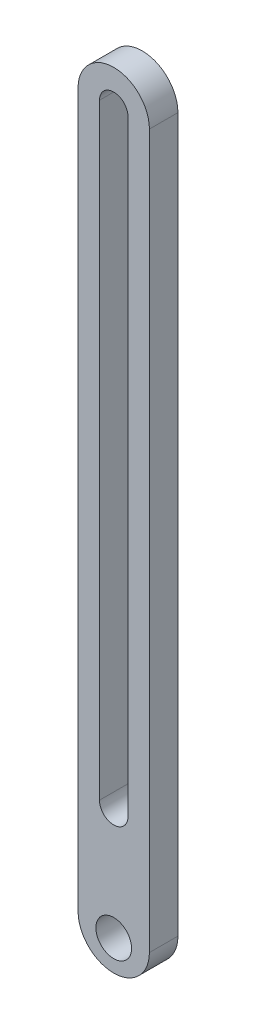
ISO-10303-21;
HEADER;
FILE_DESCRIPTION(('STEP AP214'),'2;1');
FILE_NAME('part.step','',(''),(''),'','','');
FILE_SCHEMA(('AUTOMOTIVE_DESIGN { 1 0 10303 214 1 1 1 1 }'));
ENDSEC;
DATA;
#1=APPLICATION_CONTEXT('core data for automotive mechanical design processes');
#2=APPLICATION_PROTOCOL_DEFINITION('international standard','automotive_design',2000,#1);
#3=PRODUCT_CONTEXT('',#1,'mechanical');
#4=PRODUCT('Part','Part','',(#3));
#5=PRODUCT_RELATED_PRODUCT_CATEGORY('part','',(#4));
#6=PRODUCT_DEFINITION_FORMATION('','',#4);
#7=PRODUCT_DEFINITION_CONTEXT('part definition',#1,'design');
#8=PRODUCT_DEFINITION('design','',#6,#7);
#9=PRODUCT_DEFINITION_SHAPE('','',#8);
#10=(LENGTH_UNIT() NAMED_UNIT(*) SI_UNIT(.MILLI.,.METRE.));
#11=(NAMED_UNIT(*) PLANE_ANGLE_UNIT() SI_UNIT($,.RADIAN.));
#12=(NAMED_UNIT(*) SI_UNIT($,.STERADIAN.) SOLID_ANGLE_UNIT());
#13=UNCERTAINTY_MEASURE_WITH_UNIT(LENGTH_MEASURE(1.E-05),#10,'distance_accuracy_value','');
#14=(GEOMETRIC_REPRESENTATION_CONTEXT(3) GLOBAL_UNCERTAINTY_ASSIGNED_CONTEXT((#13)) GLOBAL_UNIT_ASSIGNED_CONTEXT((#10,
#11,#12)) REPRESENTATION_CONTEXT('',''));
#15=CARTESIAN_POINT('',(0.,0.,0.));
#16=DIRECTION('',(0.,0.,1.));
#17=DIRECTION('',(1.,0.,0.));
#18=AXIS2_PLACEMENT_3D('',#15,#16,#17);
#19=CARTESIAN_POINT('',(0.,174.996075103426,8.));
#20=DIRECTION('',(0.,0.,1.));
#21=DIRECTION('',(1.,0.,0.));
#22=AXIS2_PLACEMENT_3D('',#19,#20,#21);
#23=PLANE('',#22);
#24=CARTESIAN_POINT('',(0.,-26.4824837828525,8.));
#25=DIRECTION('',(0.,0.,1.));
#26=DIRECTION('',(1.,0.,0.));
#27=AXIS2_PLACEMENT_3D('',#24,#25,#26);
#28=CIRCLE('',#27,5.);
#29=CARTESIAN_POINT('',(5.,-26.4824837828525,8.));
#30=VERTEX_POINT('',#29);
#31=EDGE_CURVE('E227',#30,#30,#28,.T.);
#32=ORIENTED_EDGE('',*,*,#31,.F.);
#33=EDGE_LOOP('',(#32));
#34=FACE_BOUND('',#33,.T.);
#35=CARTESIAN_POINT('',(0.,174.996075103426,8.));
#36=DIRECTION('',(0.,0.,1.));
#37=DIRECTION('',(1.,0.,0.));
#38=AXIS2_PLACEMENT_3D('',#35,#36,#37);
#39=CIRCLE('',#38,10.);
#40=CARTESIAN_POINT('',(10.,174.996075103426,8.));
#41=VERTEX_POINT('',#40);
#42=CARTESIAN_POINT('',(-10.,174.996075103426,8.));
#43=VERTEX_POINT('',#42);
#44=EDGE_CURVE('E139',#41,#43,#39,.T.);
#45=ORIENTED_EDGE('',*,*,#44,.T.);
#46=DIRECTION('',(0.,-1.,0.));
#47=VECTOR('',#46,1.);
#48=CARTESIAN_POINT('',(-10.,174.996075103426,8.));
#49=LINE('',#48,#47);
#50=CARTESIAN_POINT('',(-10.,-25.0039248965737,8.));
#51=VERTEX_POINT('',#50);
#52=EDGE_CURVE('E142',#43,#51,#49,.T.);
#53=ORIENTED_EDGE('',*,*,#52,.T.);
#54=CARTESIAN_POINT('',(0.,-25.0039248965737,8.));
#55=DIRECTION('',(0.,0.,1.));
#56=DIRECTION('',(1.,0.,0.));
#57=AXIS2_PLACEMENT_3D('',#54,#55,#56);
#58=CIRCLE('',#57,10.);
#59=CARTESIAN_POINT('',(10.,-25.0039248965737,8.));
#60=VERTEX_POINT('',#59);
#61=EDGE_CURVE('E145',#51,#60,#58,.T.);
#62=ORIENTED_EDGE('',*,*,#61,.T.);
#63=DIRECTION('',(0.,1.,0.));
#64=VECTOR('',#63,1.);
#65=CARTESIAN_POINT('',(10.,174.996075103426,8.));
#66=LINE('',#65,#64);
#67=EDGE_CURVE('E147',#60,#41,#66,.T.);
#68=ORIENTED_EDGE('',*,*,#67,.T.);
#69=EDGE_LOOP('',(#45,#53,#62,#68));
#70=FACE_BOUND('',#69,.T.);
#71=DIRECTION('',(0.,-1.,0.));
#72=VECTOR('',#71,1.);
#73=CARTESIAN_POINT('',(-4.,174.996075103426,8.));
#74=LINE('',#73,#72);
#75=CARTESIAN_POINT('',(-4.,174.996075103426,8.));
#76=VERTEX_POINT('',#75);
#77=CARTESIAN_POINT('',(-3.99999999999998,4.99607510342631,8.));
#78=VERTEX_POINT('',#77);
#79=EDGE_CURVE('E109',#76,#78,#74,.T.);
#80=ORIENTED_EDGE('',*,*,#79,.F.);
#81=CARTESIAN_POINT('',(0.,174.996075103426,8.));
#82=DIRECTION('',(0.,0.,1.));
#83=DIRECTION('',(1.,0.,0.));
#84=AXIS2_PLACEMENT_3D('',#81,#82,#83);
#85=CIRCLE('',#84,4.);
#86=CARTESIAN_POINT('',(4.,174.996075103426,8.));
#87=VERTEX_POINT('',#86);
#88=EDGE_CURVE('E101',#87,#76,#85,.T.);
#89=ORIENTED_EDGE('',*,*,#88,.F.);
#90=DIRECTION('',(0.,1.,0.));
#91=VECTOR('',#90,1.);
#92=CARTESIAN_POINT('',(4.,174.996075103426,8.));
#93=LINE('',#92,#91);
#94=CARTESIAN_POINT('',(4.00000000000002,4.99607510342631,8.));
#95=VERTEX_POINT('',#94);
#96=EDGE_CURVE('E123',#95,#87,#93,.T.);
#97=ORIENTED_EDGE('',*,*,#96,.F.);
#98=CARTESIAN_POINT('',(0.,4.99607510342631,8.));
#99=DIRECTION('',(0.,0.,1.));
#100=DIRECTION('',(1.,0.,0.));
#101=AXIS2_PLACEMENT_3D('',#98,#99,#100);
#102=CIRCLE('',#101,4.);
#103=EDGE_CURVE('E121',#78,#95,#102,.T.);
#104=ORIENTED_EDGE('',*,*,#103,.F.);
#105=EDGE_LOOP('',(#80,#89,#97,#104));
#106=FACE_BOUND('',#105,.T.);
#107=ADVANCED_FACE('F36',(#34,#70,#106),#23,.T.);
#108=CARTESIAN_POINT('',(0.,174.996075103426,0.));
#109=DIRECTION('',(0.,0.,1.));
#110=DIRECTION('',(1.,0.,0.));
#111=AXIS2_PLACEMENT_3D('',#108,#109,#110);
#112=PLANE('',#111);
#113=CARTESIAN_POINT('',(0.,-26.4824837828525,0.));
#114=DIRECTION('',(0.,0.,1.));
#115=DIRECTION('',(1.,0.,0.));
#116=AXIS2_PLACEMENT_3D('',#113,#114,#115);
#117=CIRCLE('',#116,5.);
#118=CARTESIAN_POINT('',(5.,-26.4824837828525,0.));
#119=VERTEX_POINT('',#118);
#120=EDGE_CURVE('E129',#119,#119,#117,.T.);
#121=ORIENTED_EDGE('',*,*,#120,.T.);
#122=EDGE_LOOP('',(#121));
#123=FACE_BOUND('',#122,.T.);
#124=CARTESIAN_POINT('',(0.,174.996075103426,0.));
#125=DIRECTION('',(0.,0.,1.));
#126=DIRECTION('',(1.,0.,0.));
#127=AXIS2_PLACEMENT_3D('',#124,#125,#126);
#128=CIRCLE('',#127,10.);
#129=CARTESIAN_POINT('',(10.,174.996075103426,0.));
#130=VERTEX_POINT('',#129);
#131=CARTESIAN_POINT('',(-10.,174.996075103426,0.));
#132=VERTEX_POINT('',#131);
#133=EDGE_CURVE('E117',#130,#132,#128,.T.);
#134=ORIENTED_EDGE('',*,*,#133,.F.);
#135=DIRECTION('',(0.,1.,0.));
#136=VECTOR('',#135,1.);
#137=CARTESIAN_POINT('',(10.,174.996075103426,0.));
#138=LINE('',#137,#136);
#139=CARTESIAN_POINT('',(10.,-25.0039248965737,0.));
#140=VERTEX_POINT('',#139);
#141=EDGE_CURVE('E143',#140,#130,#138,.T.);
#142=ORIENTED_EDGE('',*,*,#141,.F.);
#143=CARTESIAN_POINT('',(0.,-25.0039248965737,0.));
#144=DIRECTION('',(0.,0.,1.));
#145=DIRECTION('',(1.,0.,0.));
#146=AXIS2_PLACEMENT_3D('',#143,#144,#145);
#147=CIRCLE('',#146,10.);
#148=CARTESIAN_POINT('',(-10.,-25.0039248965737,0.));
#149=VERTEX_POINT('',#148);
#150=EDGE_CURVE('E154',#149,#140,#147,.T.);
#151=ORIENTED_EDGE('',*,*,#150,.F.);
#152=DIRECTION('',(0.,-1.,0.));
#153=VECTOR('',#152,1.);
#154=CARTESIAN_POINT('',(-10.,174.996075103426,0.));
#155=LINE('',#154,#153);
#156=EDGE_CURVE('E152',#132,#149,#155,.T.);
#157=ORIENTED_EDGE('',*,*,#156,.F.);
#158=EDGE_LOOP('',(#134,#142,#151,#157));
#159=FACE_BOUND('',#158,.T.);
#160=CARTESIAN_POINT('',(0.,174.996075103426,0.));
#161=DIRECTION('',(0.,0.,1.));
#162=DIRECTION('',(1.,0.,0.));
#163=AXIS2_PLACEMENT_3D('',#160,#161,#162);
#164=CIRCLE('',#163,4.);
#165=CARTESIAN_POINT('',(4.,174.996075103426,0.));
#166=VERTEX_POINT('',#165);
#167=CARTESIAN_POINT('',(-4.,174.996075103426,0.));
#168=VERTEX_POINT('',#167);
#169=EDGE_CURVE('E59',#166,#168,#164,.T.);
#170=ORIENTED_EDGE('',*,*,#169,.T.);
#171=DIRECTION('',(0.,-1.,0.));
#172=VECTOR('',#171,1.);
#173=CARTESIAN_POINT('',(-4.,174.996075103426,0.));
#174=LINE('',#173,#172);
#175=CARTESIAN_POINT('',(-3.99999999999998,4.99607510342631,0.));
#176=VERTEX_POINT('',#175);
#177=EDGE_CURVE('E116',#168,#176,#174,.T.);
#178=ORIENTED_EDGE('',*,*,#177,.T.);
#179=CARTESIAN_POINT('',(0.,4.99607510342631,0.));
#180=DIRECTION('',(0.,0.,1.));
#181=DIRECTION('',(1.,0.,0.));
#182=AXIS2_PLACEMENT_3D('',#179,#180,#181);
#183=CIRCLE('',#182,4.);
#184=CARTESIAN_POINT('',(4.00000000000002,4.99607510342631,0.));
#185=VERTEX_POINT('',#184);
#186=EDGE_CURVE('E131',#176,#185,#183,.T.);
#187=ORIENTED_EDGE('',*,*,#186,.T.);
#188=DIRECTION('',(0.,1.,0.));
#189=VECTOR('',#188,1.);
#190=CARTESIAN_POINT('',(4.,174.996075103426,0.));
#191=LINE('',#190,#189);
#192=EDGE_CURVE('E110',#185,#166,#191,.T.);
#193=ORIENTED_EDGE('',*,*,#192,.T.);
#194=EDGE_LOOP('',(#170,#178,#187,#193));
#195=FACE_BOUND('',#194,.T.);
#196=ADVANCED_FACE('F172',(#123,#159,#195),#112,.F.);
#197=CARTESIAN_POINT('',(0.,174.996075103426,8.));
#198=DIRECTION('',(0.,0.,-1.));
#199=DIRECTION('',(-1.,0.,0.));
#200=AXIS2_PLACEMENT_3D('',#197,#198,#199);
#201=CYLINDRICAL_SURFACE('',#200,10.);
#202=ORIENTED_EDGE('',*,*,#133,.T.);
#203=DIRECTION('',(0.,0.,-1.));
#204=VECTOR('',#203,1.);
#205=CARTESIAN_POINT('',(-10.,174.996075103426,8.));
#206=LINE('',#205,#204);
#207=EDGE_CURVE('E11',#43,#132,#206,.T.);
#208=ORIENTED_EDGE('',*,*,#207,.F.);
#209=ORIENTED_EDGE('',*,*,#44,.F.);
#210=DIRECTION('',(0.,0.,-1.));
#211=VECTOR('',#210,1.);
#212=CARTESIAN_POINT('',(10.,174.996075103426,8.));
#213=LINE('',#212,#211);
#214=EDGE_CURVE('E149',#41,#130,#213,.T.);
#215=ORIENTED_EDGE('',*,*,#214,.T.);
#216=EDGE_LOOP('',(#202,#208,#209,#215));
#217=FACE_BOUND('',#216,.T.);
#218=ADVANCED_FACE('F38',(#217),#201,.T.);
#219=CARTESIAN_POINT('',(-10.,174.996075103426,8.));
#220=DIRECTION('',(1.,0.,0.));
#221=DIRECTION('',(0.,1.,0.));
#222=AXIS2_PLACEMENT_3D('',#219,#220,#221);
#223=PLANE('',#222);
#224=ORIENTED_EDGE('',*,*,#156,.T.);
#225=DIRECTION('',(0.,0.,-1.));
#226=VECTOR('',#225,1.);
#227=CARTESIAN_POINT('',(-10.,-25.0039248965737,8.));
#228=LINE('',#227,#226);
#229=EDGE_CURVE('E44',#51,#149,#228,.T.);
#230=ORIENTED_EDGE('',*,*,#229,.F.);
#231=ORIENTED_EDGE('',*,*,#52,.F.);
#232=ORIENTED_EDGE('',*,*,#207,.T.);
#233=EDGE_LOOP('',(#224,#230,#231,#232));
#234=FACE_BOUND('',#233,.T.);
#235=ADVANCED_FACE('F182',(#234),#223,.F.);
#236=CARTESIAN_POINT('',(0.,-25.0039248965737,8.));
#237=DIRECTION('',(0.,0.,-1.));
#238=DIRECTION('',(-1.,0.,0.));
#239=AXIS2_PLACEMENT_3D('',#236,#237,#238);
#240=CYLINDRICAL_SURFACE('',#239,10.);
#241=ORIENTED_EDGE('',*,*,#150,.T.);
#242=DIRECTION('',(0.,0.,-1.));
#243=VECTOR('',#242,1.);
#244=CARTESIAN_POINT('',(10.,-25.0039248965737,8.));
#245=LINE('',#244,#243);
#246=EDGE_CURVE('E159',#60,#140,#245,.T.);
#247=ORIENTED_EDGE('',*,*,#246,.F.);
#248=ORIENTED_EDGE('',*,*,#61,.F.);
#249=ORIENTED_EDGE('',*,*,#229,.T.);
#250=EDGE_LOOP('',(#241,#247,#248,#249));
#251=FACE_BOUND('',#250,.T.);
#252=ADVANCED_FACE('F166',(#251),#240,.T.);
#253=CARTESIAN_POINT('',(10.,174.996075103426,8.));
#254=DIRECTION('',(-1.,0.,0.));
#255=DIRECTION('',(0.,-1.,0.));
#256=AXIS2_PLACEMENT_3D('',#253,#254,#255);
#257=PLANE('',#256);
#258=ORIENTED_EDGE('',*,*,#141,.T.);
#259=ORIENTED_EDGE('',*,*,#214,.F.);
#260=ORIENTED_EDGE('',*,*,#67,.F.);
#261=ORIENTED_EDGE('',*,*,#246,.T.);
#262=EDGE_LOOP('',(#258,#259,#260,#261));
#263=FACE_BOUND('',#262,.T.);
#264=ADVANCED_FACE('F176',(#263),#257,.F.);
#265=CARTESIAN_POINT('',(0.,174.996075103426,8.));
#266=DIRECTION('',(0.,0.,-1.));
#267=DIRECTION('',(-1.,0.,0.));
#268=AXIS2_PLACEMENT_3D('',#265,#266,#267);
#269=CYLINDRICAL_SURFACE('',#268,4.);
#270=ORIENTED_EDGE('',*,*,#169,.F.);
#271=DIRECTION('',(0.,0.,-1.));
#272=VECTOR('',#271,1.);
#273=CARTESIAN_POINT('',(4.,174.996075103426,8.));
#274=LINE('',#273,#272);
#275=EDGE_CURVE('E105',#87,#166,#274,.T.);
#276=ORIENTED_EDGE('',*,*,#275,.F.);
#277=ORIENTED_EDGE('',*,*,#88,.T.);
#278=DIRECTION('',(0.,0.,-1.));
#279=VECTOR('',#278,1.);
#280=CARTESIAN_POINT('',(-4.,174.996075103426,8.));
#281=LINE('',#280,#279);
#282=EDGE_CURVE('E104',#76,#168,#281,.T.);
#283=ORIENTED_EDGE('',*,*,#282,.T.);
#284=EDGE_LOOP('',(#270,#276,#277,#283));
#285=FACE_BOUND('',#284,.T.);
#286=ADVANCED_FACE('F103',(#285),#269,.F.);
#287=CARTESIAN_POINT('',(-4.,174.996075103426,8.));
#288=DIRECTION('',(1.,0.,0.));
#289=DIRECTION('',(0.,1.,0.));
#290=AXIS2_PLACEMENT_3D('',#287,#288,#289);
#291=PLANE('',#290);
#292=ORIENTED_EDGE('',*,*,#177,.F.);
#293=ORIENTED_EDGE('',*,*,#282,.F.);
#294=ORIENTED_EDGE('',*,*,#79,.T.);
#295=DIRECTION('',(0.,0.,-1.));
#296=VECTOR('',#295,1.);
#297=CARTESIAN_POINT('',(-3.99999999999998,4.99607510342631,8.));
#298=LINE('',#297,#296);
#299=EDGE_CURVE('E118',#78,#176,#298,.T.);
#300=ORIENTED_EDGE('',*,*,#299,.T.);
#301=EDGE_LOOP('',(#292,#293,#294,#300));
#302=FACE_BOUND('',#301,.T.);
#303=ADVANCED_FACE('F113',(#302),#291,.T.);
#304=CARTESIAN_POINT('',(0.,4.99607510342631,8.));
#305=DIRECTION('',(0.,0.,-1.));
#306=DIRECTION('',(-1.,0.,0.));
#307=AXIS2_PLACEMENT_3D('',#304,#305,#306);
#308=CYLINDRICAL_SURFACE('',#307,4.);
#309=ORIENTED_EDGE('',*,*,#186,.F.);
#310=ORIENTED_EDGE('',*,*,#299,.F.);
#311=ORIENTED_EDGE('',*,*,#103,.T.);
#312=DIRECTION('',(0.,0.,-1.));
#313=VECTOR('',#312,1.);
#314=CARTESIAN_POINT('',(4.00000000000002,4.99607510342631,8.));
#315=LINE('',#314,#313);
#316=EDGE_CURVE('E51',#95,#185,#315,.T.);
#317=ORIENTED_EDGE('',*,*,#316,.T.);
#318=EDGE_LOOP('',(#309,#310,#311,#317));
#319=FACE_BOUND('',#318,.T.);
#320=ADVANCED_FACE('F208',(#319),#308,.F.);
#321=CARTESIAN_POINT('',(4.,174.996075103426,8.));
#322=DIRECTION('',(-1.,0.,0.));
#323=DIRECTION('',(0.,-1.,0.));
#324=AXIS2_PLACEMENT_3D('',#321,#322,#323);
#325=PLANE('',#324);
#326=ORIENTED_EDGE('',*,*,#192,.F.);
#327=ORIENTED_EDGE('',*,*,#316,.F.);
#328=ORIENTED_EDGE('',*,*,#96,.T.);
#329=ORIENTED_EDGE('',*,*,#275,.T.);
#330=EDGE_LOOP('',(#326,#327,#328,#329));
#331=FACE_BOUND('',#330,.T.);
#332=ADVANCED_FACE('F212',(#331),#325,.T.);
#333=CARTESIAN_POINT('',(0.,-26.4824837828525,0.));
#334=DIRECTION('',(0.,0.,1.));
#335=DIRECTION('',(1.,0.,0.));
#336=AXIS2_PLACEMENT_3D('',#333,#334,#335);
#337=CYLINDRICAL_SURFACE('',#336,5.);
#338=ORIENTED_EDGE('',*,*,#120,.F.);
#339=EDGE_LOOP('',(#338));
#340=FACE_BOUND('',#339,.T.);
#341=ORIENTED_EDGE('',*,*,#31,.T.);
#342=EDGE_LOOP('',(#341));
#343=FACE_BOUND('',#342,.T.);
#344=ADVANCED_FACE('F218',(#340,#343),#337,.F.);
#345=CLOSED_SHELL('',(#107,#196,#218,#235,#252,#264,#286,#303,#320,#332,#344));
#346=MANIFOLD_SOLID_BREP('B2',#345);
#347=ADVANCED_BREP_SHAPE_REPRESENTATION('',(#18,#346),#14);
#348=SHAPE_DEFINITION_REPRESENTATION(#9,#347);
ENDSEC;
END-ISO-10303-21;
